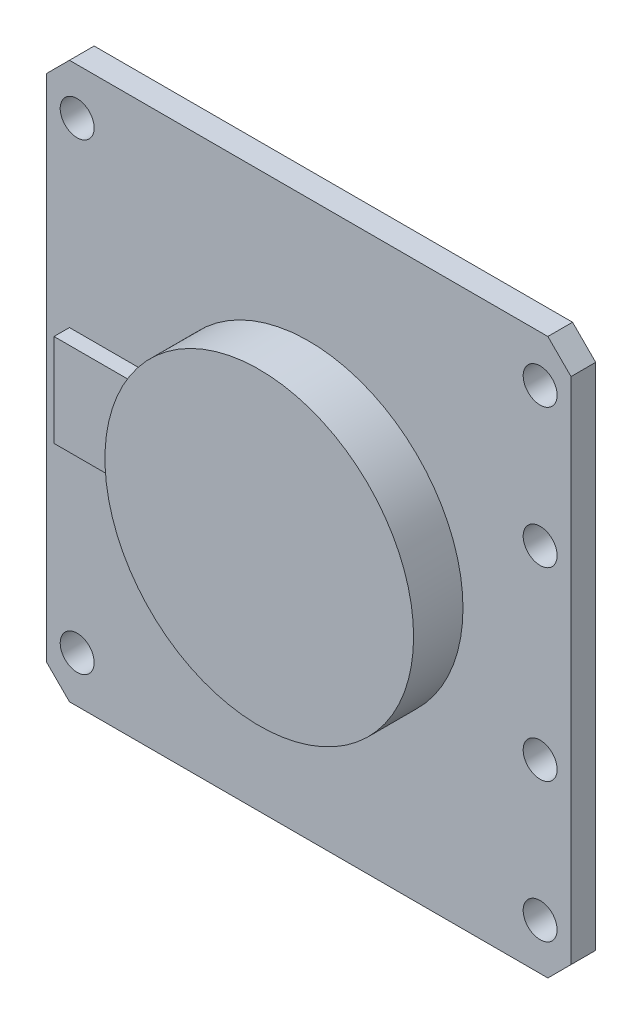
ISO-10303-21;
HEADER;
FILE_DESCRIPTION(('STEP AP214'),'2;1');
FILE_NAME('part.step','',(''),(''),'','','');
FILE_SCHEMA(('AUTOMOTIVE_DESIGN { 1 0 10303 214 1 1 1 1 }'));
ENDSEC;
DATA;
#1=APPLICATION_CONTEXT('core data for automotive mechanical design processes');
#2=APPLICATION_PROTOCOL_DEFINITION('international standard','automotive_design',2000,#1);
#3=PRODUCT_CONTEXT('',#1,'mechanical');
#4=PRODUCT('Part','Part','',(#3));
#5=PRODUCT_RELATED_PRODUCT_CATEGORY('part','',(#4));
#6=PRODUCT_DEFINITION_FORMATION('','',#4);
#7=PRODUCT_DEFINITION_CONTEXT('part definition',#1,'design');
#8=PRODUCT_DEFINITION('design','',#6,#7);
#9=PRODUCT_DEFINITION_SHAPE('','',#8);
#10=(LENGTH_UNIT() NAMED_UNIT(*) SI_UNIT(.MILLI.,.METRE.));
#11=(NAMED_UNIT(*) PLANE_ANGLE_UNIT() SI_UNIT($,.RADIAN.));
#12=(NAMED_UNIT(*) SI_UNIT($,.STERADIAN.) SOLID_ANGLE_UNIT());
#13=UNCERTAINTY_MEASURE_WITH_UNIT(LENGTH_MEASURE(1.E-05),#10,'distance_accuracy_value','');
#14=(GEOMETRIC_REPRESENTATION_CONTEXT(3) GLOBAL_UNCERTAINTY_ASSIGNED_CONTEXT((#13)) GLOBAL_UNIT_ASSIGNED_CONTEXT((#10,
#11,#12)) REPRESENTATION_CONTEXT('',''));
#15=CARTESIAN_POINT('',(0.,0.,0.));
#16=DIRECTION('',(0.,0.,1.));
#17=DIRECTION('',(1.,0.,0.));
#18=AXIS2_PLACEMENT_3D('',#15,#16,#17);
#19=CARTESIAN_POINT('',(0.,0.,1.6));
#20=DIRECTION('',(0.,0.,1.));
#21=DIRECTION('',(1.,0.,0.));
#22=AXIS2_PLACEMENT_3D('',#19,#20,#21);
#23=PLANE('',#22);
#24=CARTESIAN_POINT('',(0.,0.,1.6));
#25=DIRECTION('',(0.,0.,1.));
#26=DIRECTION('',(1.,0.,0.));
#27=AXIS2_PLACEMENT_3D('',#24,#25,#26);
#28=CIRCLE('',#27,10.);
#29=CARTESIAN_POINT('',(10.,0.,1.6));
#30=VERTEX_POINT('',#29);
#31=EDGE_CURVE('E152',#30,#30,#28,.T.);
#32=ORIENTED_EDGE('',*,*,#31,.F.);
#33=EDGE_LOOP('',(#32));
#34=FACE_BOUND('',#33,.T.);
#35=CARTESIAN_POINT('',(15.,15.,1.6));
#36=DIRECTION('',(0.,0.,1.));
#37=DIRECTION('',(-1.,0.,0.));
#38=AXIS2_PLACEMENT_3D('',#35,#36,#37);
#39=CIRCLE('',#38,1.1);
#40=CARTESIAN_POINT('',(13.9,15.,1.6));
#41=VERTEX_POINT('',#40);
#42=EDGE_CURVE('E166',#41,#41,#39,.T.);
#43=ORIENTED_EDGE('',*,*,#42,.F.);
#44=EDGE_LOOP('',(#43));
#45=FACE_BOUND('',#44,.T.);
#46=CARTESIAN_POINT('',(15.,-15.,1.6));
#47=DIRECTION('',(0.,0.,1.));
#48=DIRECTION('',(1.,0.,0.));
#49=AXIS2_PLACEMENT_3D('',#46,#47,#48);
#50=CIRCLE('',#49,1.1);
#51=CARTESIAN_POINT('',(16.1,-15.,1.6));
#52=VERTEX_POINT('',#51);
#53=EDGE_CURVE('E173',#52,#52,#50,.T.);
#54=ORIENTED_EDGE('',*,*,#53,.F.);
#55=EDGE_LOOP('',(#54));
#56=FACE_BOUND('',#55,.T.);
#57=CARTESIAN_POINT('',(-15.,-15.,1.6));
#58=DIRECTION('',(0.,0.,1.));
#59=DIRECTION('',(-1.,0.,0.));
#60=AXIS2_PLACEMENT_3D('',#57,#58,#59);
#61=CIRCLE('',#60,1.1);
#62=CARTESIAN_POINT('',(-16.1,-15.,1.6));
#63=VERTEX_POINT('',#62);
#64=EDGE_CURVE('E172',#63,#63,#61,.T.);
#65=ORIENTED_EDGE('',*,*,#64,.F.);
#66=EDGE_LOOP('',(#65));
#67=FACE_BOUND('',#66,.T.);
#68=CARTESIAN_POINT('',(15.,6.,1.6));
#69=DIRECTION('',(0.,0.,1.));
#70=DIRECTION('',(1.,0.,0.));
#71=AXIS2_PLACEMENT_3D('',#68,#69,#70);
#72=CIRCLE('',#71,1.1);
#73=CARTESIAN_POINT('',(16.1,6.,1.6));
#74=VERTEX_POINT('',#73);
#75=EDGE_CURVE('E185',#74,#74,#72,.T.);
#76=ORIENTED_EDGE('',*,*,#75,.F.);
#77=EDGE_LOOP('',(#76));
#78=FACE_BOUND('',#77,.T.);
#79=CARTESIAN_POINT('',(15.,-6.,1.6));
#80=DIRECTION('',(0.,0.,1.));
#81=DIRECTION('',(-1.,0.,0.));
#82=AXIS2_PLACEMENT_3D('',#79,#80,#81);
#83=CIRCLE('',#82,1.1);
#84=CARTESIAN_POINT('',(13.9,-6.,1.6));
#85=VERTEX_POINT('',#84);
#86=EDGE_CURVE('E161',#85,#85,#83,.T.);
#87=ORIENTED_EDGE('',*,*,#86,.F.);
#88=EDGE_LOOP('',(#87));
#89=FACE_BOUND('',#88,.T.);
#90=CARTESIAN_POINT('',(-15.,15.,1.6));
#91=DIRECTION('',(0.,0.,1.));
#92=DIRECTION('',(1.,0.,0.));
#93=AXIS2_PLACEMENT_3D('',#90,#91,#92);
#94=CIRCLE('',#93,1.1);
#95=CARTESIAN_POINT('',(-13.9,15.,1.6));
#96=VERTEX_POINT('',#95);
#97=EDGE_CURVE('E184',#96,#96,#94,.T.);
#98=ORIENTED_EDGE('',*,*,#97,.F.);
#99=EDGE_LOOP('',(#98));
#100=FACE_BOUND('',#99,.T.);
#101=DIRECTION('',(0.,-1.,0.));
#102=VECTOR('',#101,1.);
#103=CARTESIAN_POINT('',(-17.,18.,1.6));
#104=LINE('',#103,#102);
#105=CARTESIAN_POINT('',(-17.,16.5,1.6));
#106=VERTEX_POINT('',#105);
#107=CARTESIAN_POINT('',(-17.,-16.5,1.6));
#108=VERTEX_POINT('',#107);
#109=EDGE_CURVE('E199',#106,#108,#104,.T.);
#110=ORIENTED_EDGE('',*,*,#109,.T.);
#111=DIRECTION('',(-0.707106781186546,0.707106781186549,0.));
#112=VECTOR('',#111,1.);
#113=CARTESIAN_POINT('',(-16.75,-16.75,1.6));
#114=LINE('',#113,#112);
#115=CARTESIAN_POINT('',(-15.5,-18.,1.6));
#116=VERTEX_POINT('',#115);
#117=EDGE_CURVE('E244',#108,#116,#114,.F.);
#118=ORIENTED_EDGE('',*,*,#117,.T.);
#119=DIRECTION('',(1.,0.,0.));
#120=VECTOR('',#119,1.);
#121=CARTESIAN_POINT('',(-17.,-18.,1.6));
#122=LINE('',#121,#120);
#123=CARTESIAN_POINT('',(15.5,-18.,1.6));
#124=VERTEX_POINT('',#123);
#125=EDGE_CURVE('E202',#116,#124,#122,.T.);
#126=ORIENTED_EDGE('',*,*,#125,.T.);
#127=DIRECTION('',(-0.70710678118655,-0.707106781186545,0.));
#128=VECTOR('',#127,1.);
#129=CARTESIAN_POINT('',(16.7499999999999,-16.7500000000001,1.6));
#130=LINE('',#129,#128);
#131=CARTESIAN_POINT('',(17.,-16.5,1.6));
#132=VERTEX_POINT('',#131);
#133=EDGE_CURVE('E242',#124,#132,#130,.F.);
#134=ORIENTED_EDGE('',*,*,#133,.T.);
#135=DIRECTION('',(0.,1.,0.));
#136=VECTOR('',#135,1.);
#137=CARTESIAN_POINT('',(17.,18.,1.6));
#138=LINE('',#137,#136);
#139=CARTESIAN_POINT('',(17.,16.5,1.6));
#140=VERTEX_POINT('',#139);
#141=EDGE_CURVE('E206',#132,#140,#138,.T.);
#142=ORIENTED_EDGE('',*,*,#141,.T.);
#143=DIRECTION('',(0.707106781186546,-0.707106781186549,0.));
#144=VECTOR('',#143,1.);
#145=CARTESIAN_POINT('',(16.75,16.75,1.6));
#146=LINE('',#145,#144);
#147=CARTESIAN_POINT('',(15.5,18.,1.6));
#148=VERTEX_POINT('',#147);
#149=EDGE_CURVE('E238',#140,#148,#146,.F.);
#150=ORIENTED_EDGE('',*,*,#149,.T.);
#151=DIRECTION('',(-1.,0.,0.));
#152=VECTOR('',#151,1.);
#153=CARTESIAN_POINT('',(-17.,18.,1.6));
#154=LINE('',#153,#152);
#155=CARTESIAN_POINT('',(-15.5,18.,1.6));
#156=VERTEX_POINT('',#155);
#157=EDGE_CURVE('E209',#148,#156,#154,.T.);
#158=ORIENTED_EDGE('',*,*,#157,.T.);
#159=DIRECTION('',(0.707106781186549,0.707106781186546,0.));
#160=VECTOR('',#159,1.);
#161=CARTESIAN_POINT('',(-16.75,16.75,1.6));
#162=LINE('',#161,#160);
#163=EDGE_CURVE('E240',#156,#106,#162,.F.);
#164=ORIENTED_EDGE('',*,*,#163,.T.);
#165=EDGE_LOOP('',(#110,#118,#126,#134,#142,#150,#158,#164));
#166=FACE_BOUND('',#165,.T.);
#167=DIRECTION('',(1.,0.,0.));
#168=VECTOR('',#167,1.);
#169=CARTESIAN_POINT('',(-15.5,-3.,1.6));
#170=LINE('',#169,#168);
#171=CARTESIAN_POINT('',(-15.5,-3.,1.6));
#172=VERTEX_POINT('',#171);
#173=CARTESIAN_POINT('',(-10.5,-3.,1.6));
#174=VERTEX_POINT('',#173);
#175=EDGE_CURVE('E481',#172,#174,#170,.T.);
#176=ORIENTED_EDGE('',*,*,#175,.F.);
#177=DIRECTION('',(0.,-1.,0.));
#178=VECTOR('',#177,1.);
#179=CARTESIAN_POINT('',(-15.5,3.,1.6));
#180=LINE('',#179,#178);
#181=CARTESIAN_POINT('',(-15.5,3.,1.6));
#182=VERTEX_POINT('',#181);
#183=EDGE_CURVE('E150',#182,#172,#180,.T.);
#184=ORIENTED_EDGE('',*,*,#183,.F.);
#185=DIRECTION('',(-1.,0.,0.));
#186=VECTOR('',#185,1.);
#187=CARTESIAN_POINT('',(-15.5,3.,1.6));
#188=LINE('',#187,#186);
#189=CARTESIAN_POINT('',(-10.5,3.,1.6));
#190=VERTEX_POINT('',#189);
#191=EDGE_CURVE('E146',#190,#182,#188,.T.);
#192=ORIENTED_EDGE('',*,*,#191,.F.);
#193=DIRECTION('',(0.,1.,0.));
#194=VECTOR('',#193,1.);
#195=CARTESIAN_POINT('',(-10.5,3.,1.6));
#196=LINE('',#195,#194);
#197=EDGE_CURVE('E478',#174,#190,#196,.T.);
#198=ORIENTED_EDGE('',*,*,#197,.F.);
#199=EDGE_LOOP('',(#176,#184,#192,#198));
#200=FACE_BOUND('',#199,.T.);
#201=ADVANCED_FACE('F37',(#34,#45,#56,#67,#78,#89,#100,#166,#200),#23,.T.);
#202=CARTESIAN_POINT('',(-17.,18.,1.6));
#203=DIRECTION('',(1.,0.,0.));
#204=DIRECTION('',(0.,0.,-1.));
#205=AXIS2_PLACEMENT_3D('',#202,#203,#204);
#206=PLANE('',#205);
#207=DIRECTION('',(0.,-1.,0.));
#208=VECTOR('',#207,1.);
#209=CARTESIAN_POINT('',(-17.,18.,0.));
#210=LINE('',#209,#208);
#211=CARTESIAN_POINT('',(-17.,16.5,0.));
#212=VERTEX_POINT('',#211);
#213=CARTESIAN_POINT('',(-17.,-16.5,0.));
#214=VERTEX_POINT('',#213);
#215=EDGE_CURVE('E196',#212,#214,#210,.T.);
#216=ORIENTED_EDGE('',*,*,#215,.T.);
#217=DIRECTION('',(0.,0.,1.));
#218=VECTOR('',#217,1.);
#219=CARTESIAN_POINT('',(-17.,-16.5,1.6));
#220=LINE('',#219,#218);
#221=EDGE_CURVE('E236',#214,#108,#220,.T.);
#222=ORIENTED_EDGE('',*,*,#221,.T.);
#223=ORIENTED_EDGE('',*,*,#109,.F.);
#224=DIRECTION('',(0.,0.,-1.));
#225=VECTOR('',#224,1.);
#226=CARTESIAN_POINT('',(-17.,16.5,1.6));
#227=LINE('',#226,#225);
#228=EDGE_CURVE('E233',#106,#212,#227,.T.);
#229=ORIENTED_EDGE('',*,*,#228,.T.);
#230=EDGE_LOOP('',(#216,#222,#223,#229));
#231=FACE_BOUND('',#230,.T.);
#232=ADVANCED_FACE('F267',(#231),#206,.F.);
#233=CARTESIAN_POINT('',(-17.,-18.,1.6));
#234=DIRECTION('',(0.,1.,0.));
#235=DIRECTION('',(0.,0.,1.));
#236=AXIS2_PLACEMENT_3D('',#233,#234,#235);
#237=PLANE('',#236);
#238=ORIENTED_EDGE('',*,*,#125,.F.);
#239=DIRECTION('',(0.,0.,-1.));
#240=VECTOR('',#239,1.);
#241=CARTESIAN_POINT('',(-15.5,-18.,1.6));
#242=LINE('',#241,#240);
#243=CARTESIAN_POINT('',(-15.5,-18.,0.));
#244=VERTEX_POINT('',#243);
#245=EDGE_CURVE('E222',#116,#244,#242,.T.);
#246=ORIENTED_EDGE('',*,*,#245,.T.);
#247=DIRECTION('',(1.,0.,0.));
#248=VECTOR('',#247,1.);
#249=CARTESIAN_POINT('',(-17.,-18.,0.));
#250=LINE('',#249,#248);
#251=CARTESIAN_POINT('',(15.5,-18.,0.));
#252=VERTEX_POINT('',#251);
#253=EDGE_CURVE('E214',#244,#252,#250,.T.);
#254=ORIENTED_EDGE('',*,*,#253,.T.);
#255=DIRECTION('',(0.,0.,1.));
#256=VECTOR('',#255,1.);
#257=CARTESIAN_POINT('',(15.5,-18.,1.6));
#258=LINE('',#257,#256);
#259=EDGE_CURVE('E211',#252,#124,#258,.T.);
#260=ORIENTED_EDGE('',*,*,#259,.T.);
#261=EDGE_LOOP('',(#238,#246,#254,#260));
#262=FACE_BOUND('',#261,.T.);
#263=ADVANCED_FACE('F277',(#262),#237,.F.);
#264=CARTESIAN_POINT('',(17.,18.,1.6));
#265=DIRECTION('',(-1.,0.,0.));
#266=DIRECTION('',(0.,-1.,0.));
#267=AXIS2_PLACEMENT_3D('',#264,#265,#266);
#268=PLANE('',#267);
#269=ORIENTED_EDGE('',*,*,#141,.F.);
#270=DIRECTION('',(0.,0.,-1.));
#271=VECTOR('',#270,1.);
#272=CARTESIAN_POINT('',(17.,-16.5,1.6));
#273=LINE('',#272,#271);
#274=CARTESIAN_POINT('',(17.,-16.5,0.));
#275=VERTEX_POINT('',#274);
#276=EDGE_CURVE('E248',#132,#275,#273,.T.);
#277=ORIENTED_EDGE('',*,*,#276,.T.);
#278=DIRECTION('',(0.,1.,0.));
#279=VECTOR('',#278,1.);
#280=CARTESIAN_POINT('',(17.,18.,0.));
#281=LINE('',#280,#279);
#282=CARTESIAN_POINT('',(17.,16.5,0.));
#283=VERTEX_POINT('',#282);
#284=EDGE_CURVE('E217',#275,#283,#281,.T.);
#285=ORIENTED_EDGE('',*,*,#284,.T.);
#286=DIRECTION('',(0.,0.,1.));
#287=VECTOR('',#286,1.);
#288=CARTESIAN_POINT('',(17.,16.5,1.6));
#289=LINE('',#288,#287);
#290=EDGE_CURVE('E246',#283,#140,#289,.T.);
#291=ORIENTED_EDGE('',*,*,#290,.T.);
#292=EDGE_LOOP('',(#269,#277,#285,#291));
#293=FACE_BOUND('',#292,.T.);
#294=ADVANCED_FACE('F285',(#293),#268,.F.);
#295=CARTESIAN_POINT('',(-17.,18.,1.6));
#296=DIRECTION('',(0.,-1.,0.));
#297=DIRECTION('',(0.,0.,-1.));
#298=AXIS2_PLACEMENT_3D('',#295,#296,#297);
#299=PLANE('',#298);
#300=DIRECTION('',(-1.,0.,0.));
#301=VECTOR('',#300,1.);
#302=CARTESIAN_POINT('',(-17.,18.,0.));
#303=LINE('',#302,#301);
#304=CARTESIAN_POINT('',(15.5,18.,0.));
#305=VERTEX_POINT('',#304);
#306=CARTESIAN_POINT('',(-15.5,18.,0.));
#307=VERTEX_POINT('',#306);
#308=EDGE_CURVE('E203',#305,#307,#303,.T.);
#309=ORIENTED_EDGE('',*,*,#308,.T.);
#310=DIRECTION('',(0.,0.,1.));
#311=VECTOR('',#310,1.);
#312=CARTESIAN_POINT('',(-15.5,18.,1.6));
#313=LINE('',#312,#311);
#314=EDGE_CURVE('E11',#307,#156,#313,.T.);
#315=ORIENTED_EDGE('',*,*,#314,.T.);
#316=ORIENTED_EDGE('',*,*,#157,.F.);
#317=DIRECTION('',(0.,0.,-1.));
#318=VECTOR('',#317,1.);
#319=CARTESIAN_POINT('',(15.5,18.,1.6));
#320=LINE('',#319,#318);
#321=EDGE_CURVE('E46',#148,#305,#320,.T.);
#322=ORIENTED_EDGE('',*,*,#321,.T.);
#323=EDGE_LOOP('',(#309,#315,#316,#322));
#324=FACE_BOUND('',#323,.T.);
#325=ADVANCED_FACE('F253',(#324),#299,.F.);
#326=CARTESIAN_POINT('',(0.,0.,0.));
#327=DIRECTION('',(0.,0.,1.));
#328=DIRECTION('',(1.,0.,0.));
#329=AXIS2_PLACEMENT_3D('',#326,#327,#328);
#330=PLANE('',#329);
#331=CARTESIAN_POINT('',(15.,15.,0.));
#332=DIRECTION('',(0.,0.,1.));
#333=DIRECTION('',(-1.,0.,0.));
#334=AXIS2_PLACEMENT_3D('',#331,#332,#333);
#335=CIRCLE('',#334,1.1);
#336=CARTESIAN_POINT('',(13.9,15.,0.));
#337=VERTEX_POINT('',#336);
#338=EDGE_CURVE('E176',#337,#337,#335,.T.);
#339=ORIENTED_EDGE('',*,*,#338,.T.);
#340=EDGE_LOOP('',(#339));
#341=FACE_BOUND('',#340,.T.);
#342=CARTESIAN_POINT('',(15.,-15.,0.));
#343=DIRECTION('',(0.,0.,1.));
#344=DIRECTION('',(1.,0.,0.));
#345=AXIS2_PLACEMENT_3D('',#342,#343,#344);
#346=CIRCLE('',#345,1.1);
#347=CARTESIAN_POINT('',(16.1,-15.,0.));
#348=VERTEX_POINT('',#347);
#349=EDGE_CURVE('E169',#348,#348,#346,.T.);
#350=ORIENTED_EDGE('',*,*,#349,.T.);
#351=EDGE_LOOP('',(#350));
#352=FACE_BOUND('',#351,.T.);
#353=CARTESIAN_POINT('',(-15.,-15.,0.));
#354=DIRECTION('',(0.,0.,1.));
#355=DIRECTION('',(-1.,0.,0.));
#356=AXIS2_PLACEMENT_3D('',#353,#354,#355);
#357=CIRCLE('',#356,1.1);
#358=CARTESIAN_POINT('',(-16.1,-15.,0.));
#359=VERTEX_POINT('',#358);
#360=EDGE_CURVE('E188',#359,#359,#357,.T.);
#361=ORIENTED_EDGE('',*,*,#360,.T.);
#362=EDGE_LOOP('',(#361));
#363=FACE_BOUND('',#362,.T.);
#364=CARTESIAN_POINT('',(15.,6.,0.));
#365=DIRECTION('',(0.,0.,1.));
#366=DIRECTION('',(1.,0.,0.));
#367=AXIS2_PLACEMENT_3D('',#364,#365,#366);
#368=CIRCLE('',#367,1.1);
#369=CARTESIAN_POINT('',(16.1,6.,0.));
#370=VERTEX_POINT('',#369);
#371=EDGE_CURVE('E181',#370,#370,#368,.T.);
#372=ORIENTED_EDGE('',*,*,#371,.T.);
#373=EDGE_LOOP('',(#372));
#374=FACE_BOUND('',#373,.T.);
#375=CARTESIAN_POINT('',(15.,-6.,0.));
#376=DIRECTION('',(0.,0.,1.));
#377=DIRECTION('',(-1.,0.,0.));
#378=AXIS2_PLACEMENT_3D('',#375,#376,#377);
#379=CIRCLE('',#378,1.1);
#380=CARTESIAN_POINT('',(13.9,-6.,0.));
#381=VERTEX_POINT('',#380);
#382=EDGE_CURVE('E163',#381,#381,#379,.T.);
#383=ORIENTED_EDGE('',*,*,#382,.T.);
#384=EDGE_LOOP('',(#383));
#385=FACE_BOUND('',#384,.T.);
#386=CARTESIAN_POINT('',(-15.,15.,0.));
#387=DIRECTION('',(0.,0.,1.));
#388=DIRECTION('',(1.,0.,0.));
#389=AXIS2_PLACEMENT_3D('',#386,#387,#388);
#390=CIRCLE('',#389,1.1);
#391=CARTESIAN_POINT('',(-13.9,15.,0.));
#392=VERTEX_POINT('',#391);
#393=EDGE_CURVE('E193',#392,#392,#390,.T.);
#394=ORIENTED_EDGE('',*,*,#393,.T.);
#395=EDGE_LOOP('',(#394));
#396=FACE_BOUND('',#395,.T.);
#397=ORIENTED_EDGE('',*,*,#253,.F.);
#398=DIRECTION('',(0.707106781186546,-0.707106781186549,0.));
#399=VECTOR('',#398,1.);
#400=CARTESIAN_POINT('',(-15.5,-18.,0.));
#401=LINE('',#400,#399);
#402=EDGE_CURVE('E231',#244,#214,#401,.F.);
#403=ORIENTED_EDGE('',*,*,#402,.T.);
#404=ORIENTED_EDGE('',*,*,#215,.F.);
#405=DIRECTION('',(-0.707106781186549,-0.707106781186546,0.));
#406=VECTOR('',#405,1.);
#407=CARTESIAN_POINT('',(-17.,16.5,0.));
#408=LINE('',#407,#406);
#409=EDGE_CURVE('E227',#212,#307,#408,.F.);
#410=ORIENTED_EDGE('',*,*,#409,.T.);
#411=ORIENTED_EDGE('',*,*,#308,.F.);
#412=DIRECTION('',(-0.707106781186546,0.707106781186549,0.));
#413=VECTOR('',#412,1.);
#414=CARTESIAN_POINT('',(15.5,18.,0.));
#415=LINE('',#414,#413);
#416=EDGE_CURVE('E225',#305,#283,#415,.F.);
#417=ORIENTED_EDGE('',*,*,#416,.T.);
#418=ORIENTED_EDGE('',*,*,#284,.F.);
#419=DIRECTION('',(0.70710678118655,0.707106781186545,0.));
#420=VECTOR('',#419,1.);
#421=CARTESIAN_POINT('',(17.,-16.5,0.));
#422=LINE('',#421,#420);
#423=EDGE_CURVE('E229',#275,#252,#422,.F.);
#424=ORIENTED_EDGE('',*,*,#423,.T.);
#425=EDGE_LOOP('',(#397,#403,#404,#410,#411,#417,#418,#424));
#426=FACE_BOUND('',#425,.T.);
#427=ADVANCED_FACE('F258',(#341,#352,#363,#374,#385,#396,#426),#330,.F.);
#428=CARTESIAN_POINT('',(-15.5,-18.,1.6));
#429=DIRECTION('',(0.707106781186549,0.707106781186546,0.));
#430=DIRECTION('',(0.,0.,-1.));
#431=AXIS2_PLACEMENT_3D('',#428,#429,#430);
#432=PLANE('',#431);
#433=ORIENTED_EDGE('',*,*,#117,.F.);
#434=ORIENTED_EDGE('',*,*,#221,.F.);
#435=ORIENTED_EDGE('',*,*,#402,.F.);
#436=ORIENTED_EDGE('',*,*,#245,.F.);
#437=EDGE_LOOP('',(#433,#434,#435,#436));
#438=FACE_BOUND('',#437,.T.);
#439=ADVANCED_FACE('F275',(#438),#432,.F.);
#440=CARTESIAN_POINT('',(17.,-16.5,1.6));
#441=DIRECTION('',(-0.707106781186545,0.70710678118655,0.));
#442=DIRECTION('',(0.,0.,-1.));
#443=AXIS2_PLACEMENT_3D('',#440,#441,#442);
#444=PLANE('',#443);
#445=ORIENTED_EDGE('',*,*,#133,.F.);
#446=ORIENTED_EDGE('',*,*,#259,.F.);
#447=ORIENTED_EDGE('',*,*,#423,.F.);
#448=ORIENTED_EDGE('',*,*,#276,.F.);
#449=EDGE_LOOP('',(#445,#446,#447,#448));
#450=FACE_BOUND('',#449,.T.);
#451=ADVANCED_FACE('F282',(#450),#444,.F.);
#452=CARTESIAN_POINT('',(-17.,16.5,1.6));
#453=DIRECTION('',(0.707106781186546,-0.707106781186549,0.));
#454=DIRECTION('',(0.,0.,-1.));
#455=AXIS2_PLACEMENT_3D('',#452,#453,#454);
#456=PLANE('',#455);
#457=ORIENTED_EDGE('',*,*,#163,.F.);
#458=ORIENTED_EDGE('',*,*,#314,.F.);
#459=ORIENTED_EDGE('',*,*,#409,.F.);
#460=ORIENTED_EDGE('',*,*,#228,.F.);
#461=EDGE_LOOP('',(#457,#458,#459,#460));
#462=FACE_BOUND('',#461,.T.);
#463=ADVANCED_FACE('F264',(#462),#456,.F.);
#464=CARTESIAN_POINT('',(15.5,18.,1.6));
#465=DIRECTION('',(-0.707106781186549,-0.707106781186546,0.));
#466=DIRECTION('',(0.,0.,-1.));
#467=AXIS2_PLACEMENT_3D('',#464,#465,#466);
#468=PLANE('',#467);
#469=ORIENTED_EDGE('',*,*,#149,.F.);
#470=ORIENTED_EDGE('',*,*,#290,.F.);
#471=ORIENTED_EDGE('',*,*,#416,.F.);
#472=ORIENTED_EDGE('',*,*,#321,.F.);
#473=EDGE_LOOP('',(#469,#470,#471,#472));
#474=FACE_BOUND('',#473,.T.);
#475=ADVANCED_FACE('F40',(#474),#468,.F.);
#476=CARTESIAN_POINT('',(-15.,15.,0.));
#477=DIRECTION('',(0.,0.,1.));
#478=DIRECTION('',(1.,0.,0.));
#479=AXIS2_PLACEMENT_3D('',#476,#477,#478);
#480=CYLINDRICAL_SURFACE('',#479,1.1);
#481=ORIENTED_EDGE('',*,*,#393,.F.);
#482=EDGE_LOOP('',(#481));
#483=FACE_BOUND('',#482,.T.);
#484=ORIENTED_EDGE('',*,*,#97,.T.);
#485=EDGE_LOOP('',(#484));
#486=FACE_BOUND('',#485,.T.);
#487=ADVANCED_FACE('F288',(#483,#486),#480,.F.);
#488=CARTESIAN_POINT('',(15.,-6.,0.));
#489=DIRECTION('',(0.,0.,1.));
#490=DIRECTION('',(1.,0.,0.));
#491=AXIS2_PLACEMENT_3D('',#488,#489,#490);
#492=CYLINDRICAL_SURFACE('',#491,1.1);
#493=ORIENTED_EDGE('',*,*,#382,.F.);
#494=EDGE_LOOP('',(#493));
#495=FACE_BOUND('',#494,.T.);
#496=ORIENTED_EDGE('',*,*,#86,.T.);
#497=EDGE_LOOP('',(#496));
#498=FACE_BOUND('',#497,.T.);
#499=ADVANCED_FACE('F293',(#495,#498),#492,.F.);
#500=CARTESIAN_POINT('',(15.,6.,0.));
#501=DIRECTION('',(0.,0.,1.));
#502=DIRECTION('',(1.,0.,0.));
#503=AXIS2_PLACEMENT_3D('',#500,#501,#502);
#504=CYLINDRICAL_SURFACE('',#503,1.1);
#505=ORIENTED_EDGE('',*,*,#371,.F.);
#506=EDGE_LOOP('',(#505));
#507=FACE_BOUND('',#506,.T.);
#508=ORIENTED_EDGE('',*,*,#75,.T.);
#509=EDGE_LOOP('',(#508));
#510=FACE_BOUND('',#509,.T.);
#511=ADVANCED_FACE('F365',(#507,#510),#504,.F.);
#512=CARTESIAN_POINT('',(-15.,-15.,0.));
#513=DIRECTION('',(0.,0.,1.));
#514=DIRECTION('',(1.,0.,0.));
#515=AXIS2_PLACEMENT_3D('',#512,#513,#514);
#516=CYLINDRICAL_SURFACE('',#515,1.1);
#517=ORIENTED_EDGE('',*,*,#360,.F.);
#518=EDGE_LOOP('',(#517));
#519=FACE_BOUND('',#518,.T.);
#520=ORIENTED_EDGE('',*,*,#64,.T.);
#521=EDGE_LOOP('',(#520));
#522=FACE_BOUND('',#521,.T.);
#523=ADVANCED_FACE('F375',(#519,#522),#516,.F.);
#524=CARTESIAN_POINT('',(15.,-15.,0.));
#525=DIRECTION('',(0.,0.,1.));
#526=DIRECTION('',(1.,0.,0.));
#527=AXIS2_PLACEMENT_3D('',#524,#525,#526);
#528=CYLINDRICAL_SURFACE('',#527,1.1);
#529=ORIENTED_EDGE('',*,*,#349,.F.);
#530=EDGE_LOOP('',(#529));
#531=FACE_BOUND('',#530,.T.);
#532=ORIENTED_EDGE('',*,*,#53,.T.);
#533=EDGE_LOOP('',(#532));
#534=FACE_BOUND('',#533,.T.);
#535=ADVANCED_FACE('F385',(#531,#534),#528,.F.);
#536=CARTESIAN_POINT('',(15.,15.,0.));
#537=DIRECTION('',(0.,0.,1.));
#538=DIRECTION('',(1.,0.,0.));
#539=AXIS2_PLACEMENT_3D('',#536,#537,#538);
#540=CYLINDRICAL_SURFACE('',#539,1.1);
#541=ORIENTED_EDGE('',*,*,#338,.F.);
#542=EDGE_LOOP('',(#541));
#543=FACE_BOUND('',#542,.T.);
#544=ORIENTED_EDGE('',*,*,#42,.T.);
#545=EDGE_LOOP('',(#544));
#546=FACE_BOUND('',#545,.T.);
#547=ADVANCED_FACE('F394',(#543,#546),#540,.F.);
#548=CARTESIAN_POINT('',(0.,0.,4.8));
#549=DIRECTION('',(0.,0.,-1.));
#550=DIRECTION('',(-1.,0.,0.));
#551=AXIS2_PLACEMENT_3D('',#548,#549,#550);
#552=CYLINDRICAL_SURFACE('',#551,10.);
#553=CARTESIAN_POINT('',(0.,0.,4.8));
#554=DIRECTION('',(0.,0.,1.));
#555=DIRECTION('',(1.,0.,0.));
#556=AXIS2_PLACEMENT_3D('',#553,#554,#555);
#557=CIRCLE('',#556,10.);
#558=CARTESIAN_POINT('',(10.,0.,4.8));
#559=VERTEX_POINT('',#558);
#560=EDGE_CURVE('E155',#559,#559,#557,.T.);
#561=ORIENTED_EDGE('',*,*,#560,.F.);
#562=EDGE_LOOP('',(#561));
#563=FACE_BOUND('',#562,.T.);
#564=ORIENTED_EDGE('',*,*,#31,.T.);
#565=EDGE_LOOP('',(#564));
#566=FACE_BOUND('',#565,.T.);
#567=ADVANCED_FACE('F404',(#563,#566),#552,.T.);
#568=CARTESIAN_POINT('',(0.,0.,4.8));
#569=DIRECTION('',(0.,0.,1.));
#570=DIRECTION('',(1.,0.,0.));
#571=AXIS2_PLACEMENT_3D('',#568,#569,#570);
#572=PLANE('',#571);
#573=ORIENTED_EDGE('',*,*,#560,.T.);
#574=EDGE_LOOP('',(#573));
#575=FACE_BOUND('',#574,.T.);
#576=ADVANCED_FACE('F414',(#575),#572,.T.);
#577=CARTESIAN_POINT('',(-15.5,3.,2.6));
#578=DIRECTION('',(1.,0.,0.));
#579=DIRECTION('',(0.,1.,0.));
#580=AXIS2_PLACEMENT_3D('',#577,#578,#579);
#581=PLANE('',#580);
#582=ORIENTED_EDGE('',*,*,#183,.T.);
#583=DIRECTION('',(0.,0.,-1.));
#584=VECTOR('',#583,1.);
#585=CARTESIAN_POINT('',(-15.5,-3.,2.6));
#586=LINE('',#585,#584);
#587=CARTESIAN_POINT('',(-15.5,-3.,2.6));
#588=VERTEX_POINT('',#587);
#589=EDGE_CURVE('E131',#588,#172,#586,.T.);
#590=ORIENTED_EDGE('',*,*,#589,.F.);
#591=DIRECTION('',(0.,-1.,0.));
#592=VECTOR('',#591,1.);
#593=CARTESIAN_POINT('',(-15.5,3.,2.6));
#594=LINE('',#593,#592);
#595=CARTESIAN_POINT('',(-15.5,3.,2.6));
#596=VERTEX_POINT('',#595);
#597=EDGE_CURVE('E138',#596,#588,#594,.T.);
#598=ORIENTED_EDGE('',*,*,#597,.F.);
#599=DIRECTION('',(0.,0.,-1.));
#600=VECTOR('',#599,1.);
#601=CARTESIAN_POINT('',(-15.5,3.,2.6));
#602=LINE('',#601,#600);
#603=EDGE_CURVE('E476',#596,#182,#602,.T.);
#604=ORIENTED_EDGE('',*,*,#603,.T.);
#605=EDGE_LOOP('',(#582,#590,#598,#604));
#606=FACE_BOUND('',#605,.T.);
#607=ADVANCED_FACE('F148',(#606),#581,.F.);
#608=CARTESIAN_POINT('',(-15.5,-3.,2.6));
#609=DIRECTION('',(0.,1.,0.));
#610=DIRECTION('',(0.,0.,1.));
#611=AXIS2_PLACEMENT_3D('',#608,#609,#610);
#612=PLANE('',#611);
#613=ORIENTED_EDGE('',*,*,#175,.T.);
#614=DIRECTION('',(0.,0.,-1.));
#615=VECTOR('',#614,1.);
#616=CARTESIAN_POINT('',(-10.5,-3.,2.6));
#617=LINE('',#616,#615);
#618=CARTESIAN_POINT('',(-10.5,-3.,2.6));
#619=VERTEX_POINT('',#618);
#620=EDGE_CURVE('E134',#619,#174,#617,.T.);
#621=ORIENTED_EDGE('',*,*,#620,.F.);
#622=DIRECTION('',(1.,0.,0.));
#623=VECTOR('',#622,1.);
#624=CARTESIAN_POINT('',(-15.5,-3.,2.6));
#625=LINE('',#624,#623);
#626=EDGE_CURVE('E127',#588,#619,#625,.T.);
#627=ORIENTED_EDGE('',*,*,#626,.F.);
#628=ORIENTED_EDGE('',*,*,#589,.T.);
#629=EDGE_LOOP('',(#613,#621,#627,#628));
#630=FACE_BOUND('',#629,.T.);
#631=ADVANCED_FACE('F129',(#630),#612,.F.);
#632=CARTESIAN_POINT('',(-10.5,3.,2.6));
#633=DIRECTION('',(-1.,0.,0.));
#634=DIRECTION('',(0.,0.,1.));
#635=AXIS2_PLACEMENT_3D('',#632,#633,#634);
#636=PLANE('',#635);
#637=ORIENTED_EDGE('',*,*,#197,.T.);
#638=DIRECTION('',(0.,0.,-1.));
#639=VECTOR('',#638,1.);
#640=CARTESIAN_POINT('',(-10.5,3.,2.6));
#641=LINE('',#640,#639);
#642=CARTESIAN_POINT('',(-10.5,3.,2.6));
#643=VERTEX_POINT('',#642);
#644=EDGE_CURVE('E53',#643,#190,#641,.T.);
#645=ORIENTED_EDGE('',*,*,#644,.F.);
#646=DIRECTION('',(0.,1.,0.));
#647=VECTOR('',#646,1.);
#648=CARTESIAN_POINT('',(-10.5,3.,2.6));
#649=LINE('',#648,#647);
#650=EDGE_CURVE('E137',#619,#643,#649,.T.);
#651=ORIENTED_EDGE('',*,*,#650,.F.);
#652=ORIENTED_EDGE('',*,*,#620,.T.);
#653=EDGE_LOOP('',(#637,#645,#651,#652));
#654=FACE_BOUND('',#653,.T.);
#655=ADVANCED_FACE('F445',(#654),#636,.F.);
#656=CARTESIAN_POINT('',(-15.5,3.,2.6));
#657=DIRECTION('',(0.,-1.,0.));
#658=DIRECTION('',(0.,0.,-1.));
#659=AXIS2_PLACEMENT_3D('',#656,#657,#658);
#660=PLANE('',#659);
#661=ORIENTED_EDGE('',*,*,#191,.T.);
#662=ORIENTED_EDGE('',*,*,#603,.F.);
#663=DIRECTION('',(-1.,0.,0.));
#664=VECTOR('',#663,1.);
#665=CARTESIAN_POINT('',(-15.5,3.,2.6));
#666=LINE('',#665,#664);
#667=EDGE_CURVE('E142',#643,#596,#666,.T.);
#668=ORIENTED_EDGE('',*,*,#667,.F.);
#669=ORIENTED_EDGE('',*,*,#644,.T.);
#670=EDGE_LOOP('',(#661,#662,#668,#669));
#671=FACE_BOUND('',#670,.T.);
#672=ADVANCED_FACE('F454',(#671),#660,.F.);
#673=CARTESIAN_POINT('',(0.,0.,2.6));
#674=DIRECTION('',(0.,0.,1.));
#675=DIRECTION('',(1.,0.,0.));
#676=AXIS2_PLACEMENT_3D('',#673,#674,#675);
#677=PLANE('',#676);
#678=ORIENTED_EDGE('',*,*,#597,.T.);
#679=ORIENTED_EDGE('',*,*,#626,.T.);
#680=ORIENTED_EDGE('',*,*,#650,.T.);
#681=ORIENTED_EDGE('',*,*,#667,.T.);
#682=EDGE_LOOP('',(#678,#679,#680,#681));
#683=FACE_BOUND('',#682,.T.);
#684=ADVANCED_FACE('F141',(#683),#677,.T.);
#685=CLOSED_SHELL('',(#201,#232,#263,#294,#325,#427,#439,#451,#463,#475,#487,#499,#511,#523,
#535,#547,#567,#576,#607,#631,#655,#672,#684));
#686=MANIFOLD_SOLID_BREP('B2',#685);
#687=ADVANCED_BREP_SHAPE_REPRESENTATION('',(#18,#686),#14);
#688=SHAPE_DEFINITION_REPRESENTATION(#9,#687);
ENDSEC;
END-ISO-10303-21;
